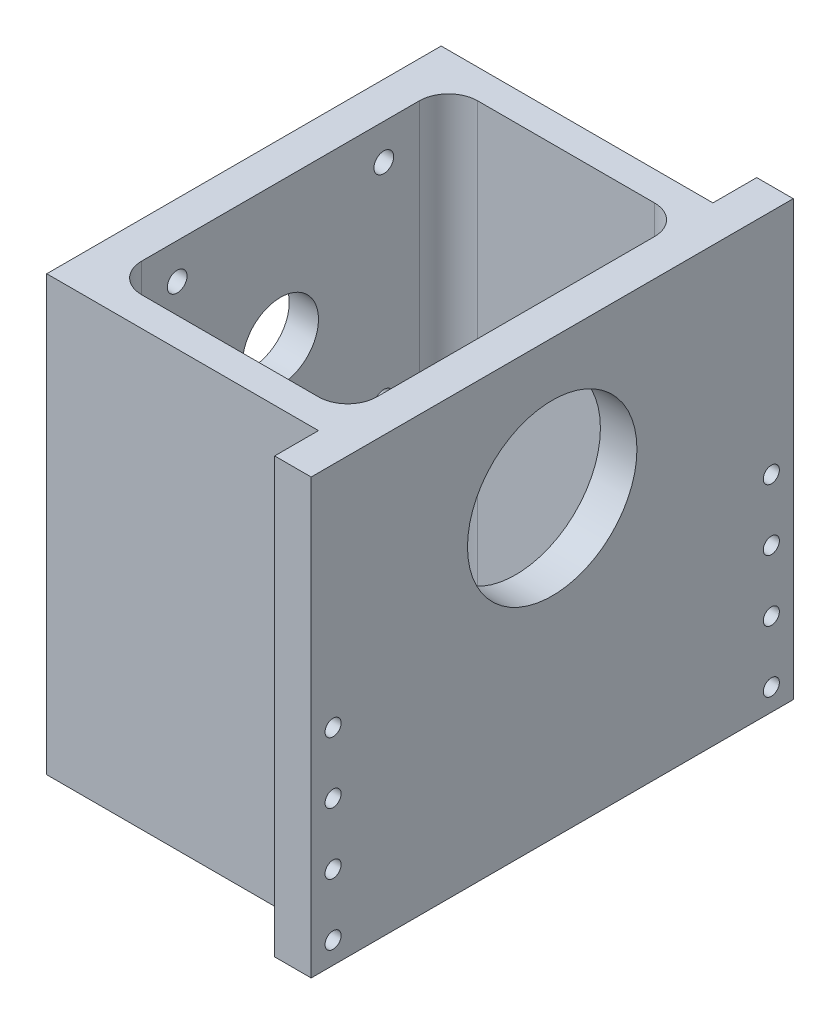
ISO-10303-21;
HEADER;
FILE_DESCRIPTION(('STEP AP214'),'2;1');
FILE_NAME('part.step','',(''),(''),'','','');
FILE_SCHEMA(('AUTOMOTIVE_DESIGN { 1 0 10303 214 1 1 1 1 }'));
ENDSEC;
DATA;
#1=APPLICATION_CONTEXT('core data for automotive mechanical design processes');
#2=APPLICATION_PROTOCOL_DEFINITION('international standard','automotive_design',2000,#1);
#3=PRODUCT_CONTEXT('',#1,'mechanical');
#4=PRODUCT('Part','Part','',(#3));
#5=PRODUCT_RELATED_PRODUCT_CATEGORY('part','',(#4));
#6=PRODUCT_DEFINITION_FORMATION('','',#4);
#7=PRODUCT_DEFINITION_CONTEXT('part definition',#1,'design');
#8=PRODUCT_DEFINITION('design','',#6,#7);
#9=PRODUCT_DEFINITION_SHAPE('','',#8);
#10=(LENGTH_UNIT() NAMED_UNIT(*) SI_UNIT(.MILLI.,.METRE.));
#11=(NAMED_UNIT(*) PLANE_ANGLE_UNIT() SI_UNIT($,.RADIAN.));
#12=(NAMED_UNIT(*) SI_UNIT($,.STERADIAN.) SOLID_ANGLE_UNIT());
#13=UNCERTAINTY_MEASURE_WITH_UNIT(LENGTH_MEASURE(1.E-05),#10,'distance_accuracy_value','');
#14=(GEOMETRIC_REPRESENTATION_CONTEXT(3) GLOBAL_UNCERTAINTY_ASSIGNED_CONTEXT((#13)) GLOBAL_UNIT_ASSIGNED_CONTEXT((#10,
#11,#12)) REPRESENTATION_CONTEXT('',''));
#15=CARTESIAN_POINT('',(0.,0.,0.));
#16=DIRECTION('',(0.,0.,1.));
#17=DIRECTION('',(1.,0.,0.));
#18=AXIS2_PLACEMENT_3D('',#15,#16,#17);
#19=CARTESIAN_POINT('',(-444.320541352272,297.,353.22492073397));
#20=DIRECTION('',(1.,0.,0.));
#21=DIRECTION('',(0.,0.,-1.));
#22=AXIS2_PLACEMENT_3D('',#19,#20,#21);
#23=PLANE('',#22);
#24=CARTESIAN_POINT('',(-444.320541352272,202.,218.22492073397));
#25=DIRECTION('',(-1.,0.,0.));
#26=DIRECTION('',(0.,0.,1.));
#27=AXIS2_PLACEMENT_3D('',#24,#25,#26);
#28=CIRCLE('',#27,57.15);
#29=CARTESIAN_POINT('',(-444.320541352272,202.,275.37492073397));
#30=VERTEX_POINT('',#29);
#31=EDGE_CURVE('E396',#30,#30,#28,.T.);
#32=ORIENTED_EDGE('',*,*,#31,.F.);
#33=EDGE_LOOP('',(#32));
#34=FACE_BOUND('',#33,.T.);
#35=DIRECTION('',(0.,0.,1.));
#36=VECTOR('',#35,1.);
#37=CARTESIAN_POINT('',(-444.320541352272,0.,353.22492073397));
#38=LINE('',#37,#36);
#39=CARTESIAN_POINT('',(-444.320541352272,0.,83.2249207339701));
#40=VERTEX_POINT('',#39);
#41=CARTESIAN_POINT('',(-444.320541352272,0.,353.22492073397));
#42=VERTEX_POINT('',#41);
#43=EDGE_CURVE('E249',#40,#42,#38,.T.);
#44=ORIENTED_EDGE('',*,*,#43,.T.);
#45=DIRECTION('',(0.,-1.,0.));
#46=VECTOR('',#45,1.);
#47=CARTESIAN_POINT('',(-444.320541352272,297.,353.22492073397));
#48=LINE('',#47,#46);
#49=CARTESIAN_POINT('',(-444.320541352272,297.,353.22492073397));
#50=VERTEX_POINT('',#49);
#51=EDGE_CURVE('E264',#50,#42,#48,.T.);
#52=ORIENTED_EDGE('',*,*,#51,.F.);
#53=DIRECTION('',(0.,0.,1.));
#54=VECTOR('',#53,1.);
#55=CARTESIAN_POINT('',(-444.320541352272,297.,353.22492073397));
#56=LINE('',#55,#54);
#57=CARTESIAN_POINT('',(-444.320541352272,297.,83.2249207339701));
#58=VERTEX_POINT('',#57);
#59=EDGE_CURVE('E232',#58,#50,#56,.T.);
#60=ORIENTED_EDGE('',*,*,#59,.F.);
#61=DIRECTION('',(0.,-1.,0.));
#62=VECTOR('',#61,1.);
#63=CARTESIAN_POINT('',(-444.320541352272,297.,83.2249207339701));
#64=LINE('',#63,#62);
#65=EDGE_CURVE('E267',#58,#40,#64,.T.);
#66=ORIENTED_EDGE('',*,*,#65,.T.);
#67=EDGE_LOOP('',(#44,#52,#60,#66));
#68=FACE_BOUND('',#67,.T.);
#69=CARTESIAN_POINT('',(-444.320541352272,272.711356230806,147.51492073397));
#70=DIRECTION('',(-1.,0.,0.));
#71=DIRECTION('',(0.,0.,1.));
#72=AXIS2_PLACEMENT_3D('',#69,#70,#71);
#73=CIRCLE('',#72,6.74999999999998);
#74=CARTESIAN_POINT('',(-444.320541352272,272.711356230806,154.26492073397));
#75=VERTEX_POINT('',#74);
#76=EDGE_CURVE('E657',#75,#75,#73,.T.);
#77=ORIENTED_EDGE('',*,*,#76,.F.);
#78=EDGE_LOOP('',(#77));
#79=FACE_BOUND('',#78,.T.);
#80=CARTESIAN_POINT('',(-444.320541352272,131.29,147.513564503164));
#81=DIRECTION('',(-1.,0.,0.));
#82=DIRECTION('',(0.,0.,1.));
#83=AXIS2_PLACEMENT_3D('',#80,#81,#82);
#84=CIRCLE('',#83,6.75000000000001);
#85=CARTESIAN_POINT('',(-444.320541352272,131.29,154.263564503164));
#86=VERTEX_POINT('',#85);
#87=EDGE_CURVE('E651',#86,#86,#84,.T.);
#88=ORIENTED_EDGE('',*,*,#87,.F.);
#89=EDGE_LOOP('',(#88));
#90=FACE_BOUND('',#89,.T.);
#91=CARTESIAN_POINT('',(-444.320541352272,131.288643769194,288.93492073397));
#92=DIRECTION('',(-1.,0.,0.));
#93=DIRECTION('',(0.,0.,1.));
#94=AXIS2_PLACEMENT_3D('',#91,#92,#93);
#95=CIRCLE('',#94,6.75000000000001);
#96=CARTESIAN_POINT('',(-444.320541352272,131.288643769194,295.68492073397));
#97=VERTEX_POINT('',#96);
#98=EDGE_CURVE('E642',#97,#97,#95,.T.);
#99=ORIENTED_EDGE('',*,*,#98,.F.);
#100=EDGE_LOOP('',(#99));
#101=FACE_BOUND('',#100,.T.);
#102=CARTESIAN_POINT('',(-444.320541352272,272.710000000001,288.936276964776));
#103=DIRECTION('',(-1.,0.,0.));
#104=DIRECTION('',(0.,0.,1.));
#105=AXIS2_PLACEMENT_3D('',#102,#103,#104);
#106=CIRCLE('',#105,6.74999999999998);
#107=CARTESIAN_POINT('',(-444.320541352272,272.710000000001,295.686276964776));
#108=VERTEX_POINT('',#107);
#109=EDGE_CURVE('E638',#108,#108,#106,.T.);
#110=ORIENTED_EDGE('',*,*,#109,.F.);
#111=EDGE_LOOP('',(#110));
#112=FACE_BOUND('',#111,.T.);
#113=ADVANCED_FACE('F41',(#34,#68,#79,#90,#101,#112),#23,.F.);
#114=CARTESIAN_POINT('',(0.,297.,0.));
#115=DIRECTION('',(0.,-1.,0.));
#116=DIRECTION('',(0.,0.,-1.));
#117=AXIS2_PLACEMENT_3D('',#114,#115,#116);
#118=PLANE('',#117);
#119=DIRECTION('',(0.,0.,-1.));
#120=VECTOR('',#119,1.);
#121=CARTESIAN_POINT('',(-233.320541352272,297.,383.22492073397));
#122=LINE('',#121,#120);
#123=CARTESIAN_POINT('',(-233.320541352272,297.,383.22492073397));
#124=VERTEX_POINT('',#123);
#125=CARTESIAN_POINT('',(-233.320541352272,297.,53.2249207339697));
#126=VERTEX_POINT('',#125);
#127=EDGE_CURVE('E222',#124,#126,#122,.T.);
#128=ORIENTED_EDGE('',*,*,#127,.T.);
#129=DIRECTION('',(-1.,0.,0.));
#130=VECTOR('',#129,1.);
#131=CARTESIAN_POINT('',(-258.320541352272,297.,53.2249207339697));
#132=LINE('',#131,#130);
#133=CARTESIAN_POINT('',(-258.320541352272,297.,53.2249207339697));
#134=VERTEX_POINT('',#133);
#135=EDGE_CURVE('E225',#126,#134,#132,.T.);
#136=ORIENTED_EDGE('',*,*,#135,.T.);
#137=DIRECTION('',(0.,0.,1.));
#138=VECTOR('',#137,1.);
#139=CARTESIAN_POINT('',(-258.320541352272,297.,83.2249207339701));
#140=LINE('',#139,#138);
#141=CARTESIAN_POINT('',(-258.320541352272,297.,83.2249207339701));
#142=VERTEX_POINT('',#141);
#143=EDGE_CURVE('E228',#134,#142,#140,.T.);
#144=ORIENTED_EDGE('',*,*,#143,.T.);
#145=DIRECTION('',(-1.,0.,0.));
#146=VECTOR('',#145,1.);
#147=CARTESIAN_POINT('',(-444.320541352272,297.,83.2249207339701));
#148=LINE('',#147,#146);
#149=EDGE_CURVE('E230',#142,#58,#148,.T.);
#150=ORIENTED_EDGE('',*,*,#149,.T.);
#151=ORIENTED_EDGE('',*,*,#59,.T.);
#152=DIRECTION('',(1.,0.,0.));
#153=VECTOR('',#152,1.);
#154=CARTESIAN_POINT('',(-444.320541352272,297.,353.22492073397));
#155=LINE('',#154,#153);
#156=CARTESIAN_POINT('',(-258.320541352272,297.,353.22492073397));
#157=VERTEX_POINT('',#156);
#158=EDGE_CURVE('E234',#50,#157,#155,.T.);
#159=ORIENTED_EDGE('',*,*,#158,.T.);
#160=DIRECTION('',(0.,0.,1.));
#161=VECTOR('',#160,1.);
#162=CARTESIAN_POINT('',(-258.320541352272,297.,383.22492073397));
#163=LINE('',#162,#161);
#164=CARTESIAN_POINT('',(-258.320541352272,297.,383.22492073397));
#165=VERTEX_POINT('',#164);
#166=EDGE_CURVE('E236',#157,#165,#163,.T.);
#167=ORIENTED_EDGE('',*,*,#166,.T.);
#168=DIRECTION('',(1.,0.,0.));
#169=VECTOR('',#168,1.);
#170=CARTESIAN_POINT('',(-258.320541352272,297.,383.22492073397));
#171=LINE('',#170,#169);
#172=EDGE_CURVE('E238',#165,#124,#171,.T.);
#173=ORIENTED_EDGE('',*,*,#172,.T.);
#174=EDGE_LOOP('',(#128,#136,#144,#150,#151,#159,#167,#173));
#175=FACE_BOUND('',#174,.T.);
#176=CARTESIAN_POINT('',(-278.320541352272,297.,123.22492073397));
#177=DIRECTION('',(0.,1.,0.));
#178=DIRECTION('',(0.,0.,1.));
#179=AXIS2_PLACEMENT_3D('',#176,#177,#178);
#180=CIRCLE('',#179,20.);
#181=CARTESIAN_POINT('',(-258.320541352272,297.,123.22492073397));
#182=VERTEX_POINT('',#181);
#183=CARTESIAN_POINT('',(-278.320541352272,297.,103.22492073397));
#184=VERTEX_POINT('',#183);
#185=EDGE_CURVE('E154',#182,#184,#180,.T.);
#186=ORIENTED_EDGE('',*,*,#185,.F.);
#187=DIRECTION('',(0.,0.,-1.));
#188=VECTOR('',#187,1.);
#189=CARTESIAN_POINT('',(-258.320541352272,297.,313.22492073397));
#190=LINE('',#189,#188);
#191=CARTESIAN_POINT('',(-258.320541352272,297.,313.22492073397));
#192=VERTEX_POINT('',#191);
#193=EDGE_CURVE('E189',#192,#182,#190,.T.);
#194=ORIENTED_EDGE('',*,*,#193,.F.);
#195=CARTESIAN_POINT('',(-278.320541352272,297.,313.22492073397));
#196=DIRECTION('',(0.,1.,0.));
#197=DIRECTION('',(0.,0.,1.));
#198=AXIS2_PLACEMENT_3D('',#195,#196,#197);
#199=CIRCLE('',#198,20.);
#200=CARTESIAN_POINT('',(-278.320541352272,297.,333.22492073397));
#201=VERTEX_POINT('',#200);
#202=EDGE_CURVE('E187',#201,#192,#199,.T.);
#203=ORIENTED_EDGE('',*,*,#202,.F.);
#204=DIRECTION('',(1.,0.,0.));
#205=VECTOR('',#204,1.);
#206=CARTESIAN_POINT('',(-399.320541352272,297.,333.22492073397));
#207=LINE('',#206,#205);
#208=CARTESIAN_POINT('',(-399.320541352272,297.,333.22492073397));
#209=VERTEX_POINT('',#208);
#210=EDGE_CURVE('E185',#209,#201,#207,.T.);
#211=ORIENTED_EDGE('',*,*,#210,.F.);
#212=CARTESIAN_POINT('',(-399.320541352272,297.,313.22492073397));
#213=DIRECTION('',(0.,1.,0.));
#214=DIRECTION('',(0.,0.,-1.));
#215=AXIS2_PLACEMENT_3D('',#212,#213,#214);
#216=CIRCLE('',#215,20.);
#217=CARTESIAN_POINT('',(-419.320541352272,297.,313.22492073397));
#218=VERTEX_POINT('',#217);
#219=EDGE_CURVE('E183',#218,#209,#216,.T.);
#220=ORIENTED_EDGE('',*,*,#219,.F.);
#221=DIRECTION('',(0.,0.,1.));
#222=VECTOR('',#221,1.);
#223=CARTESIAN_POINT('',(-419.320541352272,297.,313.22492073397));
#224=LINE('',#223,#222);
#225=CARTESIAN_POINT('',(-419.320541352272,297.,123.22492073397));
#226=VERTEX_POINT('',#225);
#227=EDGE_CURVE('E178',#226,#218,#224,.T.);
#228=ORIENTED_EDGE('',*,*,#227,.F.);
#229=CARTESIAN_POINT('',(-399.320541352272,297.,123.22492073397));
#230=DIRECTION('',(0.,1.,0.));
#231=DIRECTION('',(0.,0.,-1.));
#232=AXIS2_PLACEMENT_3D('',#229,#230,#231);
#233=CIRCLE('',#232,20.);
#234=CARTESIAN_POINT('',(-399.320541352272,297.,103.22492073397));
#235=VERTEX_POINT('',#234);
#236=EDGE_CURVE('E176',#235,#226,#233,.T.);
#237=ORIENTED_EDGE('',*,*,#236,.F.);
#238=DIRECTION('',(-1.,0.,0.));
#239=VECTOR('',#238,1.);
#240=CARTESIAN_POINT('',(-399.320541352272,297.,103.22492073397));
#241=LINE('',#240,#239);
#242=EDGE_CURVE('E162',#184,#235,#241,.T.);
#243=ORIENTED_EDGE('',*,*,#242,.F.);
#244=EDGE_LOOP('',(#186,#194,#203,#211,#220,#228,#237,#243));
#245=FACE_BOUND('',#244,.T.);
#246=ADVANCED_FACE('F174',(#175,#245),#118,.F.);
#247=CARTESIAN_POINT('',(0.,0.,0.));
#248=DIRECTION('',(0.,-1.,0.));
#249=DIRECTION('',(0.,0.,-1.));
#250=AXIS2_PLACEMENT_3D('',#247,#248,#249);
#251=PLANE('',#250);
#252=DIRECTION('',(0.,0.,-1.));
#253=VECTOR('',#252,1.);
#254=CARTESIAN_POINT('',(-233.320541352272,0.,383.22492073397));
#255=LINE('',#254,#253);
#256=CARTESIAN_POINT('',(-233.320541352272,0.,383.22492073397));
#257=VERTEX_POINT('',#256);
#258=CARTESIAN_POINT('',(-233.320541352272,0.,53.2249207339697));
#259=VERTEX_POINT('',#258);
#260=EDGE_CURVE('E170',#257,#259,#255,.T.);
#261=ORIENTED_EDGE('',*,*,#260,.F.);
#262=DIRECTION('',(1.,0.,0.));
#263=VECTOR('',#262,1.);
#264=CARTESIAN_POINT('',(-258.320541352272,0.,383.22492073397));
#265=LINE('',#264,#263);
#266=CARTESIAN_POINT('',(-258.320541352272,0.,383.22492073397));
#267=VERTEX_POINT('',#266);
#268=EDGE_CURVE('E226',#267,#257,#265,.T.);
#269=ORIENTED_EDGE('',*,*,#268,.F.);
#270=DIRECTION('',(0.,0.,1.));
#271=VECTOR('',#270,1.);
#272=CARTESIAN_POINT('',(-258.320541352272,0.,383.22492073397));
#273=LINE('',#272,#271);
#274=CARTESIAN_POINT('',(-258.320541352272,0.,353.22492073397));
#275=VERTEX_POINT('',#274);
#276=EDGE_CURVE('E253',#275,#267,#273,.T.);
#277=ORIENTED_EDGE('',*,*,#276,.F.);
#278=DIRECTION('',(1.,0.,0.));
#279=VECTOR('',#278,1.);
#280=CARTESIAN_POINT('',(-444.320541352272,0.,353.22492073397));
#281=LINE('',#280,#279);
#282=EDGE_CURVE('E251',#42,#275,#281,.T.);
#283=ORIENTED_EDGE('',*,*,#282,.F.);
#284=ORIENTED_EDGE('',*,*,#43,.F.);
#285=DIRECTION('',(-1.,0.,0.));
#286=VECTOR('',#285,1.);
#287=CARTESIAN_POINT('',(-444.320541352272,0.,83.2249207339701));
#288=LINE('',#287,#286);
#289=CARTESIAN_POINT('',(-258.320541352272,0.,83.2249207339701));
#290=VERTEX_POINT('',#289);
#291=EDGE_CURVE('E247',#290,#40,#288,.T.);
#292=ORIENTED_EDGE('',*,*,#291,.F.);
#293=DIRECTION('',(0.,0.,1.));
#294=VECTOR('',#293,1.);
#295=CARTESIAN_POINT('',(-258.320541352272,0.,83.2249207339701));
#296=LINE('',#295,#294);
#297=CARTESIAN_POINT('',(-258.320541352272,0.,53.2249207339697));
#298=VERTEX_POINT('',#297);
#299=EDGE_CURVE('E245',#298,#290,#296,.T.);
#300=ORIENTED_EDGE('',*,*,#299,.F.);
#301=DIRECTION('',(-1.,0.,0.));
#302=VECTOR('',#301,1.);
#303=CARTESIAN_POINT('',(-258.320541352272,0.,53.2249207339697));
#304=LINE('',#303,#302);
#305=EDGE_CURVE('E243',#259,#298,#304,.T.);
#306=ORIENTED_EDGE('',*,*,#305,.F.);
#307=EDGE_LOOP('',(#261,#269,#277,#283,#284,#292,#300,#306));
#308=FACE_BOUND('',#307,.T.);
#309=DIRECTION('',(0.,0.,-1.));
#310=VECTOR('',#309,1.);
#311=CARTESIAN_POINT('',(-258.320541352272,0.,313.22492073397));
#312=LINE('',#311,#310);
#313=CARTESIAN_POINT('',(-258.320541352272,0.,313.22492073397));
#314=VERTEX_POINT('',#313);
#315=CARTESIAN_POINT('',(-258.320541352272,0.,123.22492073397));
#316=VERTEX_POINT('',#315);
#317=EDGE_CURVE('E163',#314,#316,#312,.T.);
#318=ORIENTED_EDGE('',*,*,#317,.T.);
#319=CARTESIAN_POINT('',(-278.320541352272,0.,123.22492073397));
#320=DIRECTION('',(0.,1.,0.));
#321=DIRECTION('',(0.,0.,1.));
#322=AXIS2_PLACEMENT_3D('',#319,#320,#321);
#323=CIRCLE('',#322,20.);
#324=CARTESIAN_POINT('',(-278.320541352272,0.,103.22492073397));
#325=VERTEX_POINT('',#324);
#326=EDGE_CURVE('E64',#316,#325,#323,.T.);
#327=ORIENTED_EDGE('',*,*,#326,.T.);
#328=DIRECTION('',(-1.,0.,0.));
#329=VECTOR('',#328,1.);
#330=CARTESIAN_POINT('',(-399.320541352272,0.,103.22492073397));
#331=LINE('',#330,#329);
#332=CARTESIAN_POINT('',(-399.320541352272,0.,103.22492073397));
#333=VERTEX_POINT('',#332);
#334=EDGE_CURVE('E169',#325,#333,#331,.T.);
#335=ORIENTED_EDGE('',*,*,#334,.T.);
#336=CARTESIAN_POINT('',(-399.320541352272,0.,123.22492073397));
#337=DIRECTION('',(0.,1.,0.));
#338=DIRECTION('',(0.,0.,-1.));
#339=AXIS2_PLACEMENT_3D('',#336,#337,#338);
#340=CIRCLE('',#339,20.);
#341=CARTESIAN_POINT('',(-419.320541352272,0.,123.22492073397));
#342=VERTEX_POINT('',#341);
#343=EDGE_CURVE('E194',#333,#342,#340,.T.);
#344=ORIENTED_EDGE('',*,*,#343,.T.);
#345=DIRECTION('',(0.,0.,1.));
#346=VECTOR('',#345,1.);
#347=CARTESIAN_POINT('',(-419.320541352272,0.,313.22492073397));
#348=LINE('',#347,#346);
#349=CARTESIAN_POINT('',(-419.320541352272,0.,313.22492073397));
#350=VERTEX_POINT('',#349);
#351=EDGE_CURVE('E197',#342,#350,#348,.T.);
#352=ORIENTED_EDGE('',*,*,#351,.T.);
#353=CARTESIAN_POINT('',(-399.320541352272,0.,313.22492073397));
#354=DIRECTION('',(0.,1.,0.));
#355=DIRECTION('',(0.,0.,-1.));
#356=AXIS2_PLACEMENT_3D('',#353,#354,#355);
#357=CIRCLE('',#356,20.);
#358=CARTESIAN_POINT('',(-399.320541352272,0.,333.22492073397));
#359=VERTEX_POINT('',#358);
#360=EDGE_CURVE('E200',#350,#359,#357,.T.);
#361=ORIENTED_EDGE('',*,*,#360,.T.);
#362=DIRECTION('',(1.,0.,0.));
#363=VECTOR('',#362,1.);
#364=CARTESIAN_POINT('',(-399.320541352272,0.,333.22492073397));
#365=LINE('',#364,#363);
#366=CARTESIAN_POINT('',(-278.320541352272,0.,333.22492073397));
#367=VERTEX_POINT('',#366);
#368=EDGE_CURVE('E203',#359,#367,#365,.T.);
#369=ORIENTED_EDGE('',*,*,#368,.T.);
#370=CARTESIAN_POINT('',(-278.320541352272,0.,313.22492073397));
#371=DIRECTION('',(0.,1.,0.));
#372=DIRECTION('',(0.,0.,1.));
#373=AXIS2_PLACEMENT_3D('',#370,#371,#372);
#374=CIRCLE('',#373,20.);
#375=EDGE_CURVE('E206',#367,#314,#374,.T.);
#376=ORIENTED_EDGE('',*,*,#375,.T.);
#377=EDGE_LOOP('',(#318,#327,#335,#344,#352,#361,#369,#376));
#378=FACE_BOUND('',#377,.T.);
#379=ADVANCED_FACE('F283',(#308,#378),#251,.T.);
#380=CARTESIAN_POINT('',(-233.320541352272,297.,383.22492073397));
#381=DIRECTION('',(-1.,0.,0.));
#382=DIRECTION('',(0.,0.,1.));
#383=AXIS2_PLACEMENT_3D('',#380,#381,#382);
#384=PLANE('',#383);
#385=CARTESIAN_POINT('',(-233.320541352272,57.,368.22492073397));
#386=DIRECTION('',(-1.,0.,0.));
#387=DIRECTION('',(0.,0.,1.));
#388=AXIS2_PLACEMENT_3D('',#385,#386,#387);
#389=CIRCLE('',#388,5.50000000000002);
#390=CARTESIAN_POINT('',(-233.320541352272,57.,373.72492073397));
#391=VERTEX_POINT('',#390);
#392=EDGE_CURVE('E350',#391,#391,#389,.F.);
#393=ORIENTED_EDGE('',*,*,#392,.F.);
#394=EDGE_LOOP('',(#393));
#395=FACE_BOUND('',#394,.T.);
#396=CARTESIAN_POINT('',(-233.320541352272,99.,368.22492073397));
#397=DIRECTION('',(-1.,0.,0.));
#398=DIRECTION('',(0.,0.,1.));
#399=AXIS2_PLACEMENT_3D('',#396,#397,#398);
#400=CIRCLE('',#399,5.50000000000002);
#401=CARTESIAN_POINT('',(-233.320541352272,99.,373.72492073397));
#402=VERTEX_POINT('',#401);
#403=EDGE_CURVE('E354',#402,#402,#400,.F.);
#404=ORIENTED_EDGE('',*,*,#403,.F.);
#405=EDGE_LOOP('',(#404));
#406=FACE_BOUND('',#405,.T.);
#407=CARTESIAN_POINT('',(-233.320541352272,141.,368.22492073397));
#408=DIRECTION('',(-1.,0.,0.));
#409=DIRECTION('',(0.,0.,1.));
#410=AXIS2_PLACEMENT_3D('',#407,#408,#409);
#411=CIRCLE('',#410,5.50000000000002);
#412=CARTESIAN_POINT('',(-233.320541352272,141.,373.72492073397));
#413=VERTEX_POINT('',#412);
#414=EDGE_CURVE('E358',#413,#413,#411,.F.);
#415=ORIENTED_EDGE('',*,*,#414,.F.);
#416=EDGE_LOOP('',(#415));
#417=FACE_BOUND('',#416,.T.);
#418=CARTESIAN_POINT('',(-233.320541352272,141.,68.2249207339706));
#419=DIRECTION('',(-1.,0.,0.));
#420=DIRECTION('',(0.,0.,1.));
#421=AXIS2_PLACEMENT_3D('',#418,#419,#420);
#422=CIRCLE('',#421,5.50000000000002);
#423=CARTESIAN_POINT('',(-233.320541352272,141.,73.7249207339706));
#424=VERTEX_POINT('',#423);
#425=EDGE_CURVE('E362',#424,#424,#422,.F.);
#426=ORIENTED_EDGE('',*,*,#425,.F.);
#427=EDGE_LOOP('',(#426));
#428=FACE_BOUND('',#427,.T.);
#429=CARTESIAN_POINT('',(-233.320541352272,15.,68.2249207339702));
#430=DIRECTION('',(-1.,0.,0.));
#431=DIRECTION('',(0.,0.,1.));
#432=AXIS2_PLACEMENT_3D('',#429,#430,#431);
#433=CIRCLE('',#432,5.50000000000002);
#434=CARTESIAN_POINT('',(-233.320541352272,15.,73.7249207339702));
#435=VERTEX_POINT('',#434);
#436=EDGE_CURVE('E366',#435,#435,#433,.F.);
#437=ORIENTED_EDGE('',*,*,#436,.F.);
#438=EDGE_LOOP('',(#437));
#439=FACE_BOUND('',#438,.T.);
#440=CARTESIAN_POINT('',(-233.320541352272,57.,68.2249207339704));
#441=DIRECTION('',(-1.,0.,0.));
#442=DIRECTION('',(0.,0.,1.));
#443=AXIS2_PLACEMENT_3D('',#440,#441,#442);
#444=CIRCLE('',#443,5.50000000000002);
#445=CARTESIAN_POINT('',(-233.320541352272,57.,73.7249207339704));
#446=VERTEX_POINT('',#445);
#447=EDGE_CURVE('E370',#446,#446,#444,.F.);
#448=ORIENTED_EDGE('',*,*,#447,.F.);
#449=EDGE_LOOP('',(#448));
#450=FACE_BOUND('',#449,.T.);
#451=CARTESIAN_POINT('',(-233.320541352272,99.,68.2249207339705));
#452=DIRECTION('',(-1.,0.,0.));
#453=DIRECTION('',(0.,0.,1.));
#454=AXIS2_PLACEMENT_3D('',#451,#452,#453);
#455=CIRCLE('',#454,5.50000000000002);
#456=CARTESIAN_POINT('',(-233.320541352272,99.,73.7249207339705));
#457=VERTEX_POINT('',#456);
#458=EDGE_CURVE('E374',#457,#457,#455,.F.);
#459=ORIENTED_EDGE('',*,*,#458,.F.);
#460=EDGE_LOOP('',(#459));
#461=FACE_BOUND('',#460,.T.);
#462=CARTESIAN_POINT('',(-233.320541352272,15.,368.22492073397));
#463=DIRECTION('',(-1.,0.,0.));
#464=DIRECTION('',(0.,0.,1.));
#465=AXIS2_PLACEMENT_3D('',#462,#463,#464);
#466=CIRCLE('',#465,5.50000000000002);
#467=CARTESIAN_POINT('',(-233.320541352272,15.,373.72492073397));
#468=VERTEX_POINT('',#467);
#469=EDGE_CURVE('E378',#468,#468,#466,.F.);
#470=ORIENTED_EDGE('',*,*,#469,.F.);
#471=EDGE_LOOP('',(#470));
#472=FACE_BOUND('',#471,.T.);
#473=CARTESIAN_POINT('',(-233.320541352272,202.,218.22492073397));
#474=DIRECTION('',(1.,0.,0.));
#475=DIRECTION('',(0.,0.,-1.));
#476=AXIS2_PLACEMENT_3D('',#473,#474,#475);
#477=CIRCLE('',#476,58.);
#478=CARTESIAN_POINT('',(-233.320541352272,202.,160.22492073397));
#479=VERTEX_POINT('',#478);
#480=EDGE_CURVE('E381',#479,#479,#477,.T.);
#481=ORIENTED_EDGE('',*,*,#480,.F.);
#482=EDGE_LOOP('',(#481));
#483=FACE_BOUND('',#482,.T.);
#484=ORIENTED_EDGE('',*,*,#260,.T.);
#485=DIRECTION('',(0.,-1.,0.));
#486=VECTOR('',#485,1.);
#487=CARTESIAN_POINT('',(-233.320541352272,297.,53.2249207339697));
#488=LINE('',#487,#486);
#489=EDGE_CURVE('E11',#126,#259,#488,.T.);
#490=ORIENTED_EDGE('',*,*,#489,.F.);
#491=ORIENTED_EDGE('',*,*,#127,.F.);
#492=DIRECTION('',(0.,-1.,0.));
#493=VECTOR('',#492,1.);
#494=CARTESIAN_POINT('',(-233.320541352272,297.,383.22492073397));
#495=LINE('',#494,#493);
#496=EDGE_CURVE('E240',#124,#257,#495,.T.);
#497=ORIENTED_EDGE('',*,*,#496,.T.);
#498=EDGE_LOOP('',(#484,#490,#491,#497));
#499=FACE_BOUND('',#498,.T.);
#500=ADVANCED_FACE('F43',(#395,#406,#417,#428,#439,#450,#461,#472,#483,#499),#384,.F.);
#501=CARTESIAN_POINT('',(-258.320541352272,297.,53.2249207339697));
#502=DIRECTION('',(0.,0.,1.));
#503=DIRECTION('',(1.,0.,0.));
#504=AXIS2_PLACEMENT_3D('',#501,#502,#503);
#505=PLANE('',#504);
#506=ORIENTED_EDGE('',*,*,#305,.T.);
#507=DIRECTION('',(0.,-1.,0.));
#508=VECTOR('',#507,1.);
#509=CARTESIAN_POINT('',(-258.320541352272,297.,53.2249207339697));
#510=LINE('',#509,#508);
#511=EDGE_CURVE('E49',#134,#298,#510,.T.);
#512=ORIENTED_EDGE('',*,*,#511,.F.);
#513=ORIENTED_EDGE('',*,*,#135,.F.);
#514=ORIENTED_EDGE('',*,*,#489,.T.);
#515=EDGE_LOOP('',(#506,#512,#513,#514));
#516=FACE_BOUND('',#515,.T.);
#517=ADVANCED_FACE('F300',(#516),#505,.F.);
#518=CARTESIAN_POINT('',(-258.320541352272,297.,83.2249207339701));
#519=DIRECTION('',(1.,0.,0.));
#520=DIRECTION('',(0.,0.,-1.));
#521=AXIS2_PLACEMENT_3D('',#518,#519,#520);
#522=PLANE('',#521);
#523=CARTESIAN_POINT('',(-258.320541352272,141.,68.2249207339706));
#524=DIRECTION('',(-1.,0.,0.));
#525=DIRECTION('',(0.,0.,-1.));
#526=AXIS2_PLACEMENT_3D('',#523,#524,#525);
#527=CIRCLE('',#526,5.50000000000002);
#528=CARTESIAN_POINT('',(-258.320541352272,141.,62.7249207339706));
#529=VERTEX_POINT('',#528);
#530=EDGE_CURVE('E686',#529,#529,#527,.T.);
#531=ORIENTED_EDGE('',*,*,#530,.F.);
#532=EDGE_LOOP('',(#531));
#533=FACE_BOUND('',#532,.T.);
#534=CARTESIAN_POINT('',(-258.320541352272,15.,68.2249207339702));
#535=DIRECTION('',(-1.,0.,0.));
#536=DIRECTION('',(0.,0.,-1.));
#537=AXIS2_PLACEMENT_3D('',#534,#535,#536);
#538=CIRCLE('',#537,5.50000000000002);
#539=CARTESIAN_POINT('',(-258.320541352272,15.,62.7249207339702));
#540=VERTEX_POINT('',#539);
#541=EDGE_CURVE('E664',#540,#540,#538,.T.);
#542=ORIENTED_EDGE('',*,*,#541,.F.);
#543=EDGE_LOOP('',(#542));
#544=FACE_BOUND('',#543,.T.);
#545=CARTESIAN_POINT('',(-258.320541352272,57.,68.2249207339704));
#546=DIRECTION('',(-1.,0.,0.));
#547=DIRECTION('',(0.,0.,-1.));
#548=AXIS2_PLACEMENT_3D('',#545,#546,#547);
#549=CIRCLE('',#548,5.50000000000002);
#550=CARTESIAN_POINT('',(-258.320541352272,57.,62.7249207339703));
#551=VERTEX_POINT('',#550);
#552=EDGE_CURVE('E665',#551,#551,#549,.T.);
#553=ORIENTED_EDGE('',*,*,#552,.F.);
#554=EDGE_LOOP('',(#553));
#555=FACE_BOUND('',#554,.T.);
#556=CARTESIAN_POINT('',(-258.320541352272,99.,68.2249207339705));
#557=DIRECTION('',(-1.,0.,0.));
#558=DIRECTION('',(0.,0.,-1.));
#559=AXIS2_PLACEMENT_3D('',#556,#557,#558);
#560=CIRCLE('',#559,5.50000000000002);
#561=CARTESIAN_POINT('',(-258.320541352272,99.,62.7249207339704));
#562=VERTEX_POINT('',#561);
#563=EDGE_CURVE('E669',#562,#562,#560,.T.);
#564=ORIENTED_EDGE('',*,*,#563,.F.);
#565=EDGE_LOOP('',(#564));
#566=FACE_BOUND('',#565,.T.);
#567=ORIENTED_EDGE('',*,*,#299,.T.);
#568=DIRECTION('',(0.,-1.,0.));
#569=VECTOR('',#568,1.);
#570=CARTESIAN_POINT('',(-258.320541352272,297.,83.2249207339701));
#571=LINE('',#570,#569);
#572=EDGE_CURVE('E270',#142,#290,#571,.T.);
#573=ORIENTED_EDGE('',*,*,#572,.F.);
#574=ORIENTED_EDGE('',*,*,#143,.F.);
#575=ORIENTED_EDGE('',*,*,#511,.T.);
#576=EDGE_LOOP('',(#567,#573,#574,#575));
#577=FACE_BOUND('',#576,.T.);
#578=ADVANCED_FACE('F277',(#533,#544,#555,#566,#577),#522,.F.);
#579=CARTESIAN_POINT('',(-444.320541352272,297.,83.2249207339701));
#580=DIRECTION('',(0.,0.,1.));
#581=DIRECTION('',(1.,0.,0.));
#582=AXIS2_PLACEMENT_3D('',#579,#580,#581);
#583=PLANE('',#582);
#584=ORIENTED_EDGE('',*,*,#291,.T.);
#585=ORIENTED_EDGE('',*,*,#65,.F.);
#586=ORIENTED_EDGE('',*,*,#149,.F.);
#587=ORIENTED_EDGE('',*,*,#572,.T.);
#588=EDGE_LOOP('',(#584,#585,#586,#587));
#589=FACE_BOUND('',#588,.T.);
#590=ADVANCED_FACE('F289',(#589),#583,.F.);
#591=CARTESIAN_POINT('',(-444.320541352272,297.,353.22492073397));
#592=DIRECTION('',(0.,0.,-1.));
#593=DIRECTION('',(-1.,0.,0.));
#594=AXIS2_PLACEMENT_3D('',#591,#592,#593);
#595=PLANE('',#594);
#596=ORIENTED_EDGE('',*,*,#282,.T.);
#597=DIRECTION('',(0.,-1.,0.));
#598=VECTOR('',#597,1.);
#599=CARTESIAN_POINT('',(-258.320541352272,297.,353.22492073397));
#600=LINE('',#599,#598);
#601=EDGE_CURVE('E261',#157,#275,#600,.T.);
#602=ORIENTED_EDGE('',*,*,#601,.F.);
#603=ORIENTED_EDGE('',*,*,#158,.F.);
#604=ORIENTED_EDGE('',*,*,#51,.T.);
#605=EDGE_LOOP('',(#596,#602,#603,#604));
#606=FACE_BOUND('',#605,.T.);
#607=ADVANCED_FACE('F313',(#606),#595,.F.);
#608=CARTESIAN_POINT('',(-258.320541352272,297.,383.22492073397));
#609=DIRECTION('',(1.,0.,0.));
#610=DIRECTION('',(0.,0.,-1.));
#611=AXIS2_PLACEMENT_3D('',#608,#609,#610);
#612=PLANE('',#611);
#613=CARTESIAN_POINT('',(-258.320541352272,57.,368.22492073397));
#614=DIRECTION('',(-1.,0.,0.));
#615=DIRECTION('',(0.,0.,1.));
#616=AXIS2_PLACEMENT_3D('',#613,#614,#615);
#617=CIRCLE('',#616,5.50000000000002);
#618=CARTESIAN_POINT('',(-258.320541352272,57.,373.72492073397));
#619=VERTEX_POINT('',#618);
#620=EDGE_CURVE('E676',#619,#619,#617,.T.);
#621=ORIENTED_EDGE('',*,*,#620,.F.);
#622=EDGE_LOOP('',(#621));
#623=FACE_BOUND('',#622,.T.);
#624=CARTESIAN_POINT('',(-258.320541352272,99.,368.22492073397));
#625=DIRECTION('',(-1.,0.,0.));
#626=DIRECTION('',(0.,0.,1.));
#627=AXIS2_PLACEMENT_3D('',#624,#625,#626);
#628=CIRCLE('',#627,5.50000000000002);
#629=CARTESIAN_POINT('',(-258.320541352272,99.,373.72492073397));
#630=VERTEX_POINT('',#629);
#631=EDGE_CURVE('E677',#630,#630,#628,.T.);
#632=ORIENTED_EDGE('',*,*,#631,.F.);
#633=EDGE_LOOP('',(#632));
#634=FACE_BOUND('',#633,.T.);
#635=CARTESIAN_POINT('',(-258.320541352272,141.,368.22492073397));
#636=DIRECTION('',(-1.,0.,0.));
#637=DIRECTION('',(0.,0.,1.));
#638=AXIS2_PLACEMENT_3D('',#635,#636,#637);
#639=CIRCLE('',#638,5.50000000000002);
#640=CARTESIAN_POINT('',(-258.320541352272,141.,373.72492073397));
#641=VERTEX_POINT('',#640);
#642=EDGE_CURVE('E682',#641,#641,#639,.T.);
#643=ORIENTED_EDGE('',*,*,#642,.F.);
#644=EDGE_LOOP('',(#643));
#645=FACE_BOUND('',#644,.T.);
#646=CARTESIAN_POINT('',(-258.320541352272,15.,368.22492073397));
#647=DIRECTION('',(-1.,0.,0.));
#648=DIRECTION('',(0.,0.,1.));
#649=AXIS2_PLACEMENT_3D('',#646,#647,#648);
#650=CIRCLE('',#649,5.50000000000002);
#651=CARTESIAN_POINT('',(-258.320541352272,15.,373.72492073397));
#652=VERTEX_POINT('',#651);
#653=EDGE_CURVE('E680',#652,#652,#650,.T.);
#654=ORIENTED_EDGE('',*,*,#653,.F.);
#655=EDGE_LOOP('',(#654));
#656=FACE_BOUND('',#655,.T.);
#657=ORIENTED_EDGE('',*,*,#276,.T.);
#658=DIRECTION('',(0.,-1.,0.));
#659=VECTOR('',#658,1.);
#660=CARTESIAN_POINT('',(-258.320541352272,297.,383.22492073397));
#661=LINE('',#660,#659);
#662=EDGE_CURVE('E258',#165,#267,#661,.T.);
#663=ORIENTED_EDGE('',*,*,#662,.F.);
#664=ORIENTED_EDGE('',*,*,#166,.F.);
#665=ORIENTED_EDGE('',*,*,#601,.T.);
#666=EDGE_LOOP('',(#657,#663,#664,#665));
#667=FACE_BOUND('',#666,.T.);
#668=ADVANCED_FACE('F311',(#623,#634,#645,#656,#667),#612,.F.);
#669=CARTESIAN_POINT('',(-258.320541352272,297.,383.22492073397));
#670=DIRECTION('',(0.,0.,-1.));
#671=DIRECTION('',(-1.,0.,0.));
#672=AXIS2_PLACEMENT_3D('',#669,#670,#671);
#673=PLANE('',#672);
#674=ORIENTED_EDGE('',*,*,#268,.T.);
#675=ORIENTED_EDGE('',*,*,#496,.F.);
#676=ORIENTED_EDGE('',*,*,#172,.F.);
#677=ORIENTED_EDGE('',*,*,#662,.T.);
#678=EDGE_LOOP('',(#674,#675,#676,#677));
#679=FACE_BOUND('',#678,.T.);
#680=ADVANCED_FACE('F306',(#679),#673,.F.);
#681=CARTESIAN_POINT('',(-278.320541352272,297.,123.22492073397));
#682=DIRECTION('',(0.,-1.,0.));
#683=DIRECTION('',(0.,0.,-1.));
#684=AXIS2_PLACEMENT_3D('',#681,#682,#683);
#685=CYLINDRICAL_SURFACE('',#684,20.);
#686=ORIENTED_EDGE('',*,*,#326,.F.);
#687=DIRECTION('',(0.,-1.,0.));
#688=VECTOR('',#687,1.);
#689=CARTESIAN_POINT('',(-258.320541352272,297.,123.22492073397));
#690=LINE('',#689,#688);
#691=EDGE_CURVE('E158',#182,#316,#690,.T.);
#692=ORIENTED_EDGE('',*,*,#691,.F.);
#693=ORIENTED_EDGE('',*,*,#185,.T.);
#694=DIRECTION('',(0.,-1.,0.));
#695=VECTOR('',#694,1.);
#696=CARTESIAN_POINT('',(-278.320541352272,297.,103.22492073397));
#697=LINE('',#696,#695);
#698=EDGE_CURVE('E157',#184,#325,#697,.T.);
#699=ORIENTED_EDGE('',*,*,#698,.T.);
#700=EDGE_LOOP('',(#686,#692,#693,#699));
#701=FACE_BOUND('',#700,.T.);
#702=ADVANCED_FACE('F156',(#701),#685,.F.);
#703=CARTESIAN_POINT('',(-399.320541352272,297.,103.22492073397));
#704=DIRECTION('',(0.,0.,1.));
#705=DIRECTION('',(1.,0.,0.));
#706=AXIS2_PLACEMENT_3D('',#703,#704,#705);
#707=PLANE('',#706);
#708=ORIENTED_EDGE('',*,*,#334,.F.);
#709=ORIENTED_EDGE('',*,*,#698,.F.);
#710=ORIENTED_EDGE('',*,*,#242,.T.);
#711=DIRECTION('',(0.,-1.,0.));
#712=VECTOR('',#711,1.);
#713=CARTESIAN_POINT('',(-399.320541352272,297.,103.22492073397));
#714=LINE('',#713,#712);
#715=EDGE_CURVE('E171',#235,#333,#714,.T.);
#716=ORIENTED_EDGE('',*,*,#715,.T.);
#717=EDGE_LOOP('',(#708,#709,#710,#716));
#718=FACE_BOUND('',#717,.T.);
#719=ADVANCED_FACE('F166',(#718),#707,.T.);
#720=CARTESIAN_POINT('',(-399.320541352272,297.,123.22492073397));
#721=DIRECTION('',(0.,-1.,0.));
#722=DIRECTION('',(0.,0.,-1.));
#723=AXIS2_PLACEMENT_3D('',#720,#721,#722);
#724=CYLINDRICAL_SURFACE('',#723,20.);
#725=ORIENTED_EDGE('',*,*,#343,.F.);
#726=ORIENTED_EDGE('',*,*,#715,.F.);
#727=ORIENTED_EDGE('',*,*,#236,.T.);
#728=DIRECTION('',(0.,-1.,0.));
#729=VECTOR('',#728,1.);
#730=CARTESIAN_POINT('',(-419.320541352272,297.,123.22492073397));
#731=LINE('',#730,#729);
#732=EDGE_CURVE('E219',#226,#342,#731,.T.);
#733=ORIENTED_EDGE('',*,*,#732,.T.);
#734=EDGE_LOOP('',(#725,#726,#727,#733));
#735=FACE_BOUND('',#734,.T.);
#736=ADVANCED_FACE('F432',(#735),#724,.F.);
#737=CARTESIAN_POINT('',(-419.320541352272,297.,313.22492073397));
#738=DIRECTION('',(1.,0.,0.));
#739=DIRECTION('',(0.,0.,-1.));
#740=AXIS2_PLACEMENT_3D('',#737,#738,#739);
#741=PLANE('',#740);
#742=CARTESIAN_POINT('',(-419.320541352272,272.710000000001,288.936276964776));
#743=DIRECTION('',(1.,0.,0.));
#744=DIRECTION('',(0.,0.,-1.));
#745=AXIS2_PLACEMENT_3D('',#742,#743,#744);
#746=CIRCLE('',#745,6.74999999999998);
#747=CARTESIAN_POINT('',(-419.320541352272,272.710000000001,282.186276964776));
#748=VERTEX_POINT('',#747);
#749=EDGE_CURVE('E641',#748,#748,#746,.T.);
#750=ORIENTED_EDGE('',*,*,#749,.F.);
#751=EDGE_LOOP('',(#750));
#752=FACE_BOUND('',#751,.T.);
#753=CARTESIAN_POINT('',(-419.320541352272,131.288643769194,288.93492073397));
#754=DIRECTION('',(1.,0.,0.));
#755=DIRECTION('',(0.,0.,-1.));
#756=AXIS2_PLACEMENT_3D('',#753,#754,#755);
#757=CIRCLE('',#756,6.75000000000001);
#758=CARTESIAN_POINT('',(-419.320541352272,131.288643769194,282.18492073397));
#759=VERTEX_POINT('',#758);
#760=EDGE_CURVE('E645',#759,#759,#757,.T.);
#761=ORIENTED_EDGE('',*,*,#760,.F.);
#762=EDGE_LOOP('',(#761));
#763=FACE_BOUND('',#762,.T.);
#764=CARTESIAN_POINT('',(-419.320541352272,131.29,147.513564503164));
#765=DIRECTION('',(1.,0.,0.));
#766=DIRECTION('',(0.,0.,-1.));
#767=AXIS2_PLACEMENT_3D('',#764,#765,#766);
#768=CIRCLE('',#767,6.75000000000001);
#769=CARTESIAN_POINT('',(-419.320541352272,131.29,140.763564503164));
#770=VERTEX_POINT('',#769);
#771=EDGE_CURVE('E654',#770,#770,#768,.T.);
#772=ORIENTED_EDGE('',*,*,#771,.F.);
#773=EDGE_LOOP('',(#772));
#774=FACE_BOUND('',#773,.T.);
#775=CARTESIAN_POINT('',(-419.320541352272,272.711356230806,147.51492073397));
#776=DIRECTION('',(1.,0.,0.));
#777=DIRECTION('',(0.,0.,-1.));
#778=AXIS2_PLACEMENT_3D('',#775,#776,#777);
#779=CIRCLE('',#778,6.74999999999998);
#780=CARTESIAN_POINT('',(-419.320541352272,272.711356230806,140.76492073397));
#781=VERTEX_POINT('',#780);
#782=EDGE_CURVE('E660',#781,#781,#779,.T.);
#783=ORIENTED_EDGE('',*,*,#782,.F.);
#784=EDGE_LOOP('',(#783));
#785=FACE_BOUND('',#784,.T.);
#786=CARTESIAN_POINT('',(-419.320541352272,202.,218.22492073397));
#787=DIRECTION('',(1.,0.,0.));
#788=DIRECTION('',(0.,0.,-1.));
#789=AXIS2_PLACEMENT_3D('',#786,#787,#788);
#790=CIRCLE('',#789,26.);
#791=CARTESIAN_POINT('',(-419.320541352272,202.,192.22492073397));
#792=VERTEX_POINT('',#791);
#793=EDGE_CURVE('E383',#792,#792,#790,.F.);
#794=ORIENTED_EDGE('',*,*,#793,.T.);
#795=EDGE_LOOP('',(#794));
#796=FACE_BOUND('',#795,.T.);
#797=ORIENTED_EDGE('',*,*,#351,.F.);
#798=ORIENTED_EDGE('',*,*,#732,.F.);
#799=ORIENTED_EDGE('',*,*,#227,.T.);
#800=DIRECTION('',(0.,-1.,0.));
#801=VECTOR('',#800,1.);
#802=CARTESIAN_POINT('',(-419.320541352272,297.,313.22492073397));
#803=LINE('',#802,#801);
#804=EDGE_CURVE('E217',#218,#350,#803,.T.);
#805=ORIENTED_EDGE('',*,*,#804,.T.);
#806=EDGE_LOOP('',(#797,#798,#799,#805));
#807=FACE_BOUND('',#806,.T.);
#808=ADVANCED_FACE('F429',(#752,#763,#774,#785,#796,#807),#741,.T.);
#809=CARTESIAN_POINT('',(-399.320541352272,297.,313.22492073397));
#810=DIRECTION('',(0.,-1.,0.));
#811=DIRECTION('',(0.,0.,-1.));
#812=AXIS2_PLACEMENT_3D('',#809,#810,#811);
#813=CYLINDRICAL_SURFACE('',#812,20.);
#814=ORIENTED_EDGE('',*,*,#360,.F.);
#815=ORIENTED_EDGE('',*,*,#804,.F.);
#816=ORIENTED_EDGE('',*,*,#219,.T.);
#817=DIRECTION('',(0.,-1.,0.));
#818=VECTOR('',#817,1.);
#819=CARTESIAN_POINT('',(-399.320541352272,297.,333.22492073397));
#820=LINE('',#819,#818);
#821=EDGE_CURVE('E215',#209,#359,#820,.T.);
#822=ORIENTED_EDGE('',*,*,#821,.T.);
#823=EDGE_LOOP('',(#814,#815,#816,#822));
#824=FACE_BOUND('',#823,.T.);
#825=ADVANCED_FACE('F425',(#824),#813,.F.);
#826=CARTESIAN_POINT('',(-399.320541352272,297.,333.22492073397));
#827=DIRECTION('',(0.,0.,-1.));
#828=DIRECTION('',(-1.,0.,0.));
#829=AXIS2_PLACEMENT_3D('',#826,#827,#828);
#830=PLANE('',#829);
#831=ORIENTED_EDGE('',*,*,#368,.F.);
#832=ORIENTED_EDGE('',*,*,#821,.F.);
#833=ORIENTED_EDGE('',*,*,#210,.T.);
#834=DIRECTION('',(0.,-1.,0.));
#835=VECTOR('',#834,1.);
#836=CARTESIAN_POINT('',(-278.320541352272,297.,333.22492073397));
#837=LINE('',#836,#835);
#838=EDGE_CURVE('E213',#201,#367,#837,.T.);
#839=ORIENTED_EDGE('',*,*,#838,.T.);
#840=EDGE_LOOP('',(#831,#832,#833,#839));
#841=FACE_BOUND('',#840,.T.);
#842=ADVANCED_FACE('F421',(#841),#830,.T.);
#843=CARTESIAN_POINT('',(-278.320541352272,297.,313.22492073397));
#844=DIRECTION('',(0.,-1.,0.));
#845=DIRECTION('',(0.,0.,-1.));
#846=AXIS2_PLACEMENT_3D('',#843,#844,#845);
#847=CYLINDRICAL_SURFACE('',#846,20.);
#848=ORIENTED_EDGE('',*,*,#375,.F.);
#849=ORIENTED_EDGE('',*,*,#838,.F.);
#850=ORIENTED_EDGE('',*,*,#202,.T.);
#851=DIRECTION('',(0.,-1.,0.));
#852=VECTOR('',#851,1.);
#853=CARTESIAN_POINT('',(-258.320541352272,297.,313.22492073397));
#854=LINE('',#853,#852);
#855=EDGE_CURVE('E56',#192,#314,#854,.T.);
#856=ORIENTED_EDGE('',*,*,#855,.T.);
#857=EDGE_LOOP('',(#848,#849,#850,#856));
#858=FACE_BOUND('',#857,.T.);
#859=ADVANCED_FACE('F414',(#858),#847,.F.);
#860=CARTESIAN_POINT('',(-258.320541352272,297.,313.22492073397));
#861=DIRECTION('',(-1.,0.,0.));
#862=DIRECTION('',(0.,0.,1.));
#863=AXIS2_PLACEMENT_3D('',#860,#861,#862);
#864=PLANE('',#863);
#865=CARTESIAN_POINT('',(-258.320541352272,202.,218.22492073397));
#866=DIRECTION('',(-1.,0.,0.));
#867=DIRECTION('',(0.,0.,1.));
#868=AXIS2_PLACEMENT_3D('',#865,#866,#867);
#869=CIRCLE('',#868,58.);
#870=CARTESIAN_POINT('',(-258.320541352272,202.,276.22492073397));
#871=VERTEX_POINT('',#870);
#872=EDGE_CURVE('E384',#871,#871,#869,.F.);
#873=ORIENTED_EDGE('',*,*,#872,.T.);
#874=EDGE_LOOP('',(#873));
#875=FACE_BOUND('',#874,.T.);
#876=ORIENTED_EDGE('',*,*,#317,.F.);
#877=ORIENTED_EDGE('',*,*,#855,.F.);
#878=ORIENTED_EDGE('',*,*,#193,.T.);
#879=ORIENTED_EDGE('',*,*,#691,.T.);
#880=EDGE_LOOP('',(#876,#877,#878,#879));
#881=FACE_BOUND('',#880,.T.);
#882=ADVANCED_FACE('F403',(#875,#881),#864,.T.);
#883=CARTESIAN_POINT('',(-439.320541352272,202.,218.22492073397));
#884=DIRECTION('',(-1.,0.,0.));
#885=DIRECTION('',(0.,0.,1.));
#886=AXIS2_PLACEMENT_3D('',#883,#884,#885);
#887=CYLINDRICAL_SURFACE('',#886,57.15);
#888=CARTESIAN_POINT('',(-439.320541352272,202.,218.22492073397));
#889=DIRECTION('',(-1.,0.,0.));
#890=DIRECTION('',(0.,0.,1.));
#891=AXIS2_PLACEMENT_3D('',#888,#889,#890);
#892=CIRCLE('',#891,57.15);
#893=CARTESIAN_POINT('',(-439.320541352272,202.,275.37492073397));
#894=VERTEX_POINT('',#893);
#895=EDGE_CURVE('E192',#894,#894,#892,.T.);
#896=ORIENTED_EDGE('',*,*,#895,.F.);
#897=EDGE_LOOP('',(#896));
#898=FACE_BOUND('',#897,.T.);
#899=ORIENTED_EDGE('',*,*,#31,.T.);
#900=EDGE_LOOP('',(#899));
#901=FACE_BOUND('',#900,.T.);
#902=ADVANCED_FACE('F400',(#898,#901),#887,.F.);
#903=CARTESIAN_POINT('',(-439.320541352272,202.,218.22492073397));
#904=DIRECTION('',(-1.,0.,0.));
#905=DIRECTION('',(0.,0.,1.));
#906=AXIS2_PLACEMENT_3D('',#903,#904,#905);
#907=PLANE('',#906);
#908=CARTESIAN_POINT('',(-439.320541352272,202.,218.22492073397));
#909=DIRECTION('',(-1.,0.,0.));
#910=DIRECTION('',(0.,0.,1.));
#911=AXIS2_PLACEMENT_3D('',#908,#909,#910);
#912=CIRCLE('',#911,26.);
#913=CARTESIAN_POINT('',(-439.320541352272,202.,244.22492073397));
#914=VERTEX_POINT('',#913);
#915=EDGE_CURVE('E387',#914,#914,#912,.T.);
#916=ORIENTED_EDGE('',*,*,#915,.F.);
#917=EDGE_LOOP('',(#916));
#918=FACE_BOUND('',#917,.T.);
#919=ORIENTED_EDGE('',*,*,#895,.T.);
#920=EDGE_LOOP('',(#919));
#921=FACE_BOUND('',#920,.T.);
#922=ADVANCED_FACE('F402',(#918,#921),#907,.T.);
#923=CARTESIAN_POINT('',(-233.319541352272,202.,218.22492073397));
#924=DIRECTION('',(-1.,0.,0.));
#925=DIRECTION('',(0.,0.,1.));
#926=AXIS2_PLACEMENT_3D('',#923,#924,#925);
#927=CYLINDRICAL_SURFACE('',#926,26.);
#928=ORIENTED_EDGE('',*,*,#793,.F.);
#929=EDGE_LOOP('',(#928));
#930=FACE_BOUND('',#929,.T.);
#931=ORIENTED_EDGE('',*,*,#915,.T.);
#932=EDGE_LOOP('',(#931));
#933=FACE_BOUND('',#932,.T.);
#934=ADVANCED_FACE('F410',(#930,#933),#927,.F.);
#935=CARTESIAN_POINT('',(-444.321541352272,202.,218.22492073397));
#936=DIRECTION('',(1.,0.,0.));
#937=DIRECTION('',(0.,0.,-1.));
#938=AXIS2_PLACEMENT_3D('',#935,#936,#937);
#939=CYLINDRICAL_SURFACE('',#938,58.);
#940=ORIENTED_EDGE('',*,*,#872,.F.);
#941=EDGE_LOOP('',(#940));
#942=FACE_BOUND('',#941,.T.);
#943=ORIENTED_EDGE('',*,*,#480,.T.);
#944=EDGE_LOOP('',(#943));
#945=FACE_BOUND('',#944,.T.);
#946=ADVANCED_FACE('F501',(#942,#945),#939,.F.);
#947=CARTESIAN_POINT('',(-233.319541352272,15.,368.22492073397));
#948=DIRECTION('',(-1.,0.,0.));
#949=DIRECTION('',(0.,0.,1.));
#950=AXIS2_PLACEMENT_3D('',#947,#948,#949);
#951=CYLINDRICAL_SURFACE('',#950,5.50000000000002);
#952=ORIENTED_EDGE('',*,*,#653,.T.);
#953=EDGE_LOOP('',(#952));
#954=FACE_BOUND('',#953,.T.);
#955=ORIENTED_EDGE('',*,*,#469,.T.);
#956=EDGE_LOOP('',(#955));
#957=FACE_BOUND('',#956,.T.);
#958=ADVANCED_FACE('F509',(#954,#957),#951,.F.);
#959=CARTESIAN_POINT('',(-233.319541352272,141.,368.22492073397));
#960=DIRECTION('',(-1.,0.,0.));
#961=DIRECTION('',(0.,0.,1.));
#962=AXIS2_PLACEMENT_3D('',#959,#960,#961);
#963=CYLINDRICAL_SURFACE('',#962,5.50000000000002);
#964=ORIENTED_EDGE('',*,*,#642,.T.);
#965=EDGE_LOOP('',(#964));
#966=FACE_BOUND('',#965,.T.);
#967=ORIENTED_EDGE('',*,*,#414,.T.);
#968=EDGE_LOOP('',(#967));
#969=FACE_BOUND('',#968,.T.);
#970=ADVANCED_FACE('F519',(#966,#969),#963,.F.);
#971=CARTESIAN_POINT('',(-233.319541352272,99.,368.22492073397));
#972=DIRECTION('',(-1.,0.,0.));
#973=DIRECTION('',(0.,0.,1.));
#974=AXIS2_PLACEMENT_3D('',#971,#972,#973);
#975=CYLINDRICAL_SURFACE('',#974,5.50000000000002);
#976=ORIENTED_EDGE('',*,*,#631,.T.);
#977=EDGE_LOOP('',(#976));
#978=FACE_BOUND('',#977,.T.);
#979=ORIENTED_EDGE('',*,*,#403,.T.);
#980=EDGE_LOOP('',(#979));
#981=FACE_BOUND('',#980,.T.);
#982=ADVANCED_FACE('F529',(#978,#981),#975,.F.);
#983=CARTESIAN_POINT('',(-233.319541352272,57.,368.22492073397));
#984=DIRECTION('',(-1.,0.,0.));
#985=DIRECTION('',(0.,0.,1.));
#986=AXIS2_PLACEMENT_3D('',#983,#984,#985);
#987=CYLINDRICAL_SURFACE('',#986,5.50000000000002);
#988=ORIENTED_EDGE('',*,*,#620,.T.);
#989=EDGE_LOOP('',(#988));
#990=FACE_BOUND('',#989,.T.);
#991=ORIENTED_EDGE('',*,*,#392,.T.);
#992=EDGE_LOOP('',(#991));
#993=FACE_BOUND('',#992,.T.);
#994=ADVANCED_FACE('F539',(#990,#993),#987,.F.);
#995=CARTESIAN_POINT('',(-233.319541352272,99.,68.2249207339705));
#996=DIRECTION('',(-1.,0.,0.));
#997=DIRECTION('',(0.,0.,1.));
#998=AXIS2_PLACEMENT_3D('',#995,#996,#997);
#999=CYLINDRICAL_SURFACE('',#998,5.50000000000002);
#1000=ORIENTED_EDGE('',*,*,#563,.T.);
#1001=EDGE_LOOP('',(#1000));
#1002=FACE_BOUND('',#1001,.T.);
#1003=ORIENTED_EDGE('',*,*,#458,.T.);
#1004=EDGE_LOOP('',(#1003));
#1005=FACE_BOUND('',#1004,.T.);
#1006=ADVANCED_FACE('F549',(#1002,#1005),#999,.F.);
#1007=CARTESIAN_POINT('',(-233.319541352272,57.,68.2249207339704));
#1008=DIRECTION('',(-1.,0.,0.));
#1009=DIRECTION('',(0.,0.,1.));
#1010=AXIS2_PLACEMENT_3D('',#1007,#1008,#1009);
#1011=CYLINDRICAL_SURFACE('',#1010,5.50000000000002);
#1012=ORIENTED_EDGE('',*,*,#552,.T.);
#1013=EDGE_LOOP('',(#1012));
#1014=FACE_BOUND('',#1013,.T.);
#1015=ORIENTED_EDGE('',*,*,#447,.T.);
#1016=EDGE_LOOP('',(#1015));
#1017=FACE_BOUND('',#1016,.T.);
#1018=ADVANCED_FACE('F559',(#1014,#1017),#1011,.F.);
#1019=CARTESIAN_POINT('',(-233.319541352272,15.,68.2249207339702));
#1020=DIRECTION('',(-1.,0.,0.));
#1021=DIRECTION('',(0.,0.,1.));
#1022=AXIS2_PLACEMENT_3D('',#1019,#1020,#1021);
#1023=CYLINDRICAL_SURFACE('',#1022,5.50000000000002);
#1024=ORIENTED_EDGE('',*,*,#541,.T.);
#1025=EDGE_LOOP('',(#1024));
#1026=FACE_BOUND('',#1025,.T.);
#1027=ORIENTED_EDGE('',*,*,#436,.T.);
#1028=EDGE_LOOP('',(#1027));
#1029=FACE_BOUND('',#1028,.T.);
#1030=ADVANCED_FACE('F569',(#1026,#1029),#1023,.F.);
#1031=CARTESIAN_POINT('',(-233.319541352272,141.,68.2249207339706));
#1032=DIRECTION('',(-1.,0.,0.));
#1033=DIRECTION('',(0.,0.,1.));
#1034=AXIS2_PLACEMENT_3D('',#1031,#1032,#1033);
#1035=CYLINDRICAL_SURFACE('',#1034,5.50000000000002);
#1036=ORIENTED_EDGE('',*,*,#530,.T.);
#1037=EDGE_LOOP('',(#1036));
#1038=FACE_BOUND('',#1037,.T.);
#1039=ORIENTED_EDGE('',*,*,#425,.T.);
#1040=EDGE_LOOP('',(#1039));
#1041=FACE_BOUND('',#1040,.T.);
#1042=ADVANCED_FACE('F579',(#1038,#1041),#1035,.F.);
#1043=CARTESIAN_POINT('',(-444.320541352272,272.711356230806,147.51492073397));
#1044=DIRECTION('',(-1.,0.,0.));
#1045=DIRECTION('',(0.,0.,1.));
#1046=AXIS2_PLACEMENT_3D('',#1043,#1044,#1045);
#1047=CYLINDRICAL_SURFACE('',#1046,6.74999999999998);
#1048=ORIENTED_EDGE('',*,*,#76,.T.);
#1049=EDGE_LOOP('',(#1048));
#1050=FACE_BOUND('',#1049,.T.);
#1051=ORIENTED_EDGE('',*,*,#782,.T.);
#1052=EDGE_LOOP('',(#1051));
#1053=FACE_BOUND('',#1052,.T.);
#1054=ADVANCED_FACE('F589',(#1050,#1053),#1047,.F.);
#1055=CARTESIAN_POINT('',(-444.320541352272,131.29,147.513564503164));
#1056=DIRECTION('',(-1.,0.,0.));
#1057=DIRECTION('',(0.,0.,1.));
#1058=AXIS2_PLACEMENT_3D('',#1055,#1056,#1057);
#1059=CYLINDRICAL_SURFACE('',#1058,6.75000000000001);
#1060=ORIENTED_EDGE('',*,*,#87,.T.);
#1061=EDGE_LOOP('',(#1060));
#1062=FACE_BOUND('',#1061,.T.);
#1063=ORIENTED_EDGE('',*,*,#771,.T.);
#1064=EDGE_LOOP('',(#1063));
#1065=FACE_BOUND('',#1064,.T.);
#1066=ADVANCED_FACE('F597',(#1062,#1065),#1059,.F.);
#1067=CARTESIAN_POINT('',(-444.320541352272,131.288643769194,288.93492073397));
#1068=DIRECTION('',(-1.,0.,0.));
#1069=DIRECTION('',(0.,0.,1.));
#1070=AXIS2_PLACEMENT_3D('',#1067,#1068,#1069);
#1071=CYLINDRICAL_SURFACE('',#1070,6.75000000000001);
#1072=ORIENTED_EDGE('',*,*,#98,.T.);
#1073=EDGE_LOOP('',(#1072));
#1074=FACE_BOUND('',#1073,.T.);
#1075=ORIENTED_EDGE('',*,*,#760,.T.);
#1076=EDGE_LOOP('',(#1075));
#1077=FACE_BOUND('',#1076,.T.);
#1078=ADVANCED_FACE('F612',(#1074,#1077),#1071,.F.);
#1079=CARTESIAN_POINT('',(-444.320541352272,272.710000000001,288.936276964776));
#1080=DIRECTION('',(-1.,0.,0.));
#1081=DIRECTION('',(0.,0.,1.));
#1082=AXIS2_PLACEMENT_3D('',#1079,#1080,#1081);
#1083=CYLINDRICAL_SURFACE('',#1082,6.74999999999998);
#1084=ORIENTED_EDGE('',*,*,#109,.T.);
#1085=EDGE_LOOP('',(#1084));
#1086=FACE_BOUND('',#1085,.T.);
#1087=ORIENTED_EDGE('',*,*,#749,.T.);
#1088=EDGE_LOOP('',(#1087));
#1089=FACE_BOUND('',#1088,.T.);
#1090=ADVANCED_FACE('F622',(#1086,#1089),#1083,.F.);
#1091=CLOSED_SHELL('',(#113,#246,#379,#500,#517,#578,#590,#607,#668,#680,#702,#719,#736,#808,
#825,#842,#859,#882,#902,#922,#934,#946,#958,#970,#982,#994,#1006,#1018,#1030,#1042,#1054,#1066,
#1078,#1090));
#1092=MANIFOLD_SOLID_BREP('B2',#1091);
#1093=ADVANCED_BREP_SHAPE_REPRESENTATION('',(#18,#1092),#14);
#1094=SHAPE_DEFINITION_REPRESENTATION(#9,#1093);
ENDSEC;
END-ISO-10303-21;
